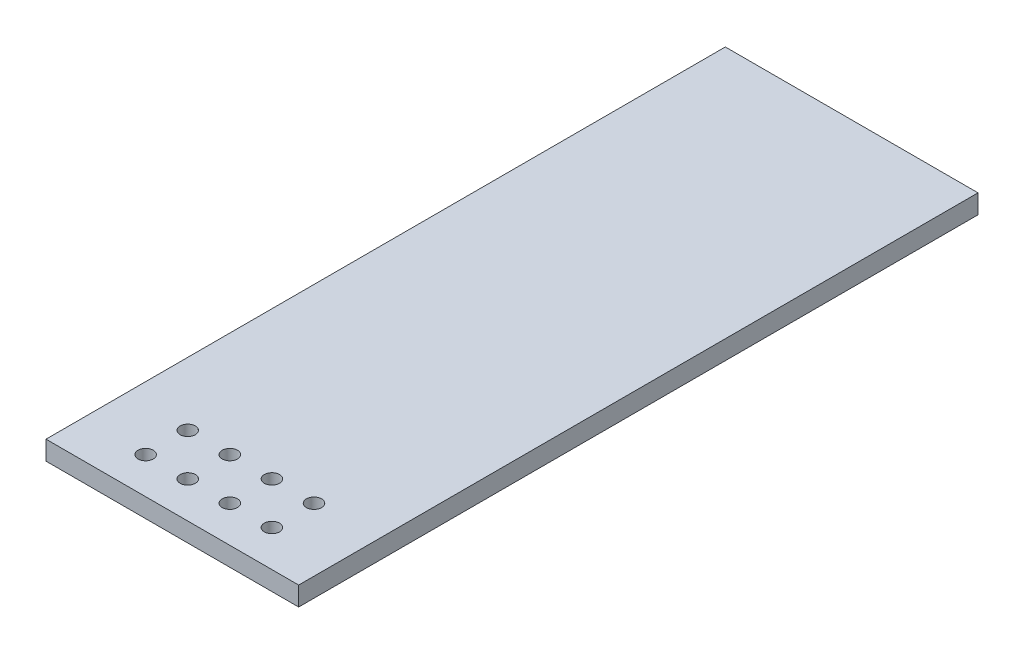
ISO-10303-21;
HEADER;
FILE_DESCRIPTION(('STEP AP214'),'2;1');
FILE_NAME('part.step','',(''),(''),'','','');
FILE_SCHEMA(('AUTOMOTIVE_DESIGN { 1 0 10303 214 1 1 1 1 }'));
ENDSEC;
DATA;
#1=APPLICATION_CONTEXT('core data for automotive mechanical design processes');
#2=APPLICATION_PROTOCOL_DEFINITION('international standard','automotive_design',2000,#1);
#3=PRODUCT_CONTEXT('',#1,'mechanical');
#4=PRODUCT('Part','Part','',(#3));
#5=PRODUCT_RELATED_PRODUCT_CATEGORY('part','',(#4));
#6=PRODUCT_DEFINITION_FORMATION('','',#4);
#7=PRODUCT_DEFINITION_CONTEXT('part definition',#1,'design');
#8=PRODUCT_DEFINITION('design','',#6,#7);
#9=PRODUCT_DEFINITION_SHAPE('','',#8);
#10=(LENGTH_UNIT() NAMED_UNIT(*) SI_UNIT(.MILLI.,.METRE.));
#11=(NAMED_UNIT(*) PLANE_ANGLE_UNIT() SI_UNIT($,.RADIAN.));
#12=(NAMED_UNIT(*) SI_UNIT($,.STERADIAN.) SOLID_ANGLE_UNIT());
#13=UNCERTAINTY_MEASURE_WITH_UNIT(LENGTH_MEASURE(1.E-05),#10,'distance_accuracy_value','');
#14=(GEOMETRIC_REPRESENTATION_CONTEXT(3) GLOBAL_UNCERTAINTY_ASSIGNED_CONTEXT((#13)) GLOBAL_UNIT_ASSIGNED_CONTEXT((#10,
#11,#12)) REPRESENTATION_CONTEXT('',''));
#15=CARTESIAN_POINT('',(0.,0.,0.));
#16=DIRECTION('',(0.,0.,1.));
#17=DIRECTION('',(1.,0.,0.));
#18=AXIS2_PLACEMENT_3D('',#15,#16,#17);
#19=CARTESIAN_POINT('',(0.,1.15,0.));
#20=DIRECTION('',(0.,1.,0.));
#21=DIRECTION('',(0.,0.,1.));
#22=AXIS2_PLACEMENT_3D('',#19,#20,#21);
#23=PLANE('',#22);
#24=DIRECTION('',(0.,0.,1.));
#25=VECTOR('',#24,1.);
#26=CARTESIAN_POINT('',(7.625,1.15,20.5));
#27=LINE('',#26,#25);
#28=CARTESIAN_POINT('',(7.625,1.15,20.5));
#29=VERTEX_POINT('',#28);
#30=CARTESIAN_POINT('',(7.625,1.15,-20.5));
#31=VERTEX_POINT('',#30);
#32=EDGE_CURVE('E55',#29,#31,#27,.F.);
#33=ORIENTED_EDGE('',*,*,#32,.T.);
#34=DIRECTION('',(1.,0.,0.));
#35=VECTOR('',#34,1.);
#36=CARTESIAN_POINT('',(7.625,1.15,-20.5));
#37=LINE('',#36,#35);
#38=CARTESIAN_POINT('',(-7.625,1.15,-20.5));
#39=VERTEX_POINT('',#38);
#40=EDGE_CURVE('E344',#31,#39,#37,.F.);
#41=ORIENTED_EDGE('',*,*,#40,.T.);
#42=DIRECTION('',(0.,0.,-1.));
#43=VECTOR('',#42,1.);
#44=CARTESIAN_POINT('',(-7.625,1.15,20.5));
#45=LINE('',#44,#43);
#46=CARTESIAN_POINT('',(-7.625,1.15,20.5));
#47=VERTEX_POINT('',#46);
#48=EDGE_CURVE('E60',#39,#47,#45,.F.);
#49=ORIENTED_EDGE('',*,*,#48,.T.);
#50=DIRECTION('',(-1.,0.,0.));
#51=VECTOR('',#50,1.);
#52=CARTESIAN_POINT('',(7.625,1.15,20.5));
#53=LINE('',#52,#51);
#54=EDGE_CURVE('E58',#47,#29,#53,.F.);
#55=ORIENTED_EDGE('',*,*,#54,.T.);
#56=EDGE_LOOP('',(#33,#41,#49,#55));
#57=FACE_BOUND('',#56,.T.);
#58=CARTESIAN_POINT('',(-3.81,1.15,18.3));
#59=DIRECTION('',(0.,1.,0.));
#60=DIRECTION('',(0.,0.,1.));
#61=AXIS2_PLACEMENT_3D('',#58,#59,#60);
#62=CIRCLE('',#61,0.459999999999999);
#63=CARTESIAN_POINT('',(-3.81,1.15,18.76));
#64=VERTEX_POINT('',#63);
#65=EDGE_CURVE('E66',#64,#64,#62,.F.);
#66=ORIENTED_EDGE('',*,*,#65,.T.);
#67=EDGE_LOOP('',(#66));
#68=FACE_BOUND('',#67,.T.);
#69=CARTESIAN_POINT('',(3.81,1.15,18.3));
#70=DIRECTION('',(0.,1.,0.));
#71=DIRECTION('',(0.,0.,1.));
#72=AXIS2_PLACEMENT_3D('',#69,#70,#71);
#73=CIRCLE('',#72,0.459999999999999);
#74=CARTESIAN_POINT('',(3.81,1.15,18.76));
#75=VERTEX_POINT('',#74);
#76=EDGE_CURVE('E108',#75,#75,#73,.F.);
#77=ORIENTED_EDGE('',*,*,#76,.T.);
#78=EDGE_LOOP('',(#77));
#79=FACE_BOUND('',#78,.T.);
#80=CARTESIAN_POINT('',(1.27,1.15,18.3));
#81=DIRECTION('',(0.,1.,0.));
#82=DIRECTION('',(0.,0.,1.));
#83=AXIS2_PLACEMENT_3D('',#80,#81,#82);
#84=CIRCLE('',#83,0.459999999999999);
#85=CARTESIAN_POINT('',(1.27,1.15,18.76));
#86=VERTEX_POINT('',#85);
#87=EDGE_CURVE('E111',#86,#86,#84,.F.);
#88=ORIENTED_EDGE('',*,*,#87,.T.);
#89=EDGE_LOOP('',(#88));
#90=FACE_BOUND('',#89,.T.);
#91=CARTESIAN_POINT('',(-1.27,1.15,18.3));
#92=DIRECTION('',(0.,1.,0.));
#93=DIRECTION('',(0.,0.,1.));
#94=AXIS2_PLACEMENT_3D('',#91,#92,#93);
#95=CIRCLE('',#94,0.459999999999999);
#96=CARTESIAN_POINT('',(-1.27,1.15,18.76));
#97=VERTEX_POINT('',#96);
#98=EDGE_CURVE('E114',#97,#97,#95,.F.);
#99=ORIENTED_EDGE('',*,*,#98,.T.);
#100=EDGE_LOOP('',(#99));
#101=FACE_BOUND('',#100,.T.);
#102=CARTESIAN_POINT('',(3.81,1.15,15.76));
#103=DIRECTION('',(0.,1.,0.));
#104=DIRECTION('',(0.,0.,1.));
#105=AXIS2_PLACEMENT_3D('',#102,#103,#104);
#106=CIRCLE('',#105,0.459999999999999);
#107=CARTESIAN_POINT('',(3.81,1.15,16.22));
#108=VERTEX_POINT('',#107);
#109=EDGE_CURVE('E117',#108,#108,#106,.F.);
#110=ORIENTED_EDGE('',*,*,#109,.T.);
#111=EDGE_LOOP('',(#110));
#112=FACE_BOUND('',#111,.T.);
#113=CARTESIAN_POINT('',(1.27,1.15,15.76));
#114=DIRECTION('',(0.,1.,0.));
#115=DIRECTION('',(0.,0.,1.));
#116=AXIS2_PLACEMENT_3D('',#113,#114,#115);
#117=CIRCLE('',#116,0.459999999999999);
#118=CARTESIAN_POINT('',(1.27,1.15,16.22));
#119=VERTEX_POINT('',#118);
#120=EDGE_CURVE('E120',#119,#119,#117,.F.);
#121=ORIENTED_EDGE('',*,*,#120,.T.);
#122=EDGE_LOOP('',(#121));
#123=FACE_BOUND('',#122,.T.);
#124=CARTESIAN_POINT('',(-1.27,1.15,15.76));
#125=DIRECTION('',(0.,1.,0.));
#126=DIRECTION('',(0.,0.,1.));
#127=AXIS2_PLACEMENT_3D('',#124,#125,#126);
#128=CIRCLE('',#127,0.459999999999999);
#129=CARTESIAN_POINT('',(-1.27,1.15,16.22));
#130=VERTEX_POINT('',#129);
#131=EDGE_CURVE('E122',#130,#130,#128,.F.);
#132=ORIENTED_EDGE('',*,*,#131,.T.);
#133=EDGE_LOOP('',(#132));
#134=FACE_BOUND('',#133,.T.);
#135=CARTESIAN_POINT('',(-3.81,1.15,15.76));
#136=DIRECTION('',(0.,1.,0.));
#137=DIRECTION('',(0.,0.,1.));
#138=AXIS2_PLACEMENT_3D('',#135,#136,#137);
#139=CIRCLE('',#138,0.459999999999999);
#140=CARTESIAN_POINT('',(-3.81,1.15,16.22));
#141=VERTEX_POINT('',#140);
#142=EDGE_CURVE('E20',#141,#141,#139,.F.);
#143=ORIENTED_EDGE('',*,*,#142,.T.);
#144=EDGE_LOOP('',(#143));
#145=FACE_BOUND('',#144,.T.);
#146=ADVANCED_FACE('F17',(#57,#68,#79,#90,#101,#112,#123,#134,#145),#23,.T.);
#147=CARTESIAN_POINT('',(-3.81,-1.30107647738325,15.76));
#148=DIRECTION('',(0.,1.,0.));
#149=DIRECTION('',(0.,0.,1.));
#150=AXIS2_PLACEMENT_3D('',#147,#148,#149);
#151=CYLINDRICAL_SURFACE('',#150,0.459999999999999);
#152=ORIENTED_EDGE('',*,*,#142,.F.);
#153=EDGE_LOOP('',(#152));
#154=FACE_BOUND('',#153,.T.);
#155=CARTESIAN_POINT('',(-3.81,0.,15.76));
#156=DIRECTION('',(0.,1.,0.));
#157=DIRECTION('',(0.,0.,1.));
#158=AXIS2_PLACEMENT_3D('',#155,#156,#157);
#159=CIRCLE('',#158,0.459999999999999);
#160=CARTESIAN_POINT('',(-3.81,0.,16.22));
#161=VERTEX_POINT('',#160);
#162=EDGE_CURVE('E102',#161,#161,#159,.F.);
#163=ORIENTED_EDGE('',*,*,#162,.T.);
#164=EDGE_LOOP('',(#163));
#165=FACE_BOUND('',#164,.T.);
#166=ADVANCED_FACE('F130',(#154,#165),#151,.F.);
#167=CARTESIAN_POINT('',(-1.27,-1.30107647738325,15.76));
#168=DIRECTION('',(0.,1.,0.));
#169=DIRECTION('',(0.,0.,1.));
#170=AXIS2_PLACEMENT_3D('',#167,#168,#169);
#171=CYLINDRICAL_SURFACE('',#170,0.459999999999999);
#172=ORIENTED_EDGE('',*,*,#131,.F.);
#173=EDGE_LOOP('',(#172));
#174=FACE_BOUND('',#173,.T.);
#175=CARTESIAN_POINT('',(-1.27,0.,15.76));
#176=DIRECTION('',(0.,1.,0.));
#177=DIRECTION('',(0.,0.,1.));
#178=AXIS2_PLACEMENT_3D('',#175,#176,#177);
#179=CIRCLE('',#178,0.459999999999999);
#180=CARTESIAN_POINT('',(-1.27,0.,16.22));
#181=VERTEX_POINT('',#180);
#182=EDGE_CURVE('E99',#181,#181,#179,.F.);
#183=ORIENTED_EDGE('',*,*,#182,.T.);
#184=EDGE_LOOP('',(#183));
#185=FACE_BOUND('',#184,.T.);
#186=ADVANCED_FACE('F133',(#174,#185),#171,.F.);
#187=CARTESIAN_POINT('',(1.27,-1.30107647738325,15.76));
#188=DIRECTION('',(0.,1.,0.));
#189=DIRECTION('',(0.,0.,1.));
#190=AXIS2_PLACEMENT_3D('',#187,#188,#189);
#191=CYLINDRICAL_SURFACE('',#190,0.459999999999999);
#192=ORIENTED_EDGE('',*,*,#120,.F.);
#193=EDGE_LOOP('',(#192));
#194=FACE_BOUND('',#193,.T.);
#195=CARTESIAN_POINT('',(1.27,0.,15.76));
#196=DIRECTION('',(0.,1.,0.));
#197=DIRECTION('',(0.,0.,1.));
#198=AXIS2_PLACEMENT_3D('',#195,#196,#197);
#199=CIRCLE('',#198,0.459999999999999);
#200=CARTESIAN_POINT('',(1.27,0.,16.22));
#201=VERTEX_POINT('',#200);
#202=EDGE_CURVE('E96',#201,#201,#199,.F.);
#203=ORIENTED_EDGE('',*,*,#202,.T.);
#204=EDGE_LOOP('',(#203));
#205=FACE_BOUND('',#204,.T.);
#206=ADVANCED_FACE('F176',(#194,#205),#191,.F.);
#207=CARTESIAN_POINT('',(3.81,-1.30107647738325,15.76));
#208=DIRECTION('',(0.,1.,0.));
#209=DIRECTION('',(0.,0.,1.));
#210=AXIS2_PLACEMENT_3D('',#207,#208,#209);
#211=CYLINDRICAL_SURFACE('',#210,0.459999999999999);
#212=ORIENTED_EDGE('',*,*,#109,.F.);
#213=EDGE_LOOP('',(#212));
#214=FACE_BOUND('',#213,.T.);
#215=CARTESIAN_POINT('',(3.81,0.,15.76));
#216=DIRECTION('',(0.,1.,0.));
#217=DIRECTION('',(0.,0.,1.));
#218=AXIS2_PLACEMENT_3D('',#215,#216,#217);
#219=CIRCLE('',#218,0.459999999999999);
#220=CARTESIAN_POINT('',(3.81,0.,16.22));
#221=VERTEX_POINT('',#220);
#222=EDGE_CURVE('E93',#221,#221,#219,.F.);
#223=ORIENTED_EDGE('',*,*,#222,.T.);
#224=EDGE_LOOP('',(#223));
#225=FACE_BOUND('',#224,.T.);
#226=ADVANCED_FACE('F172',(#214,#225),#211,.F.);
#227=CARTESIAN_POINT('',(-1.27,-1.30107647738325,18.3));
#228=DIRECTION('',(0.,1.,0.));
#229=DIRECTION('',(0.,0.,1.));
#230=AXIS2_PLACEMENT_3D('',#227,#228,#229);
#231=CYLINDRICAL_SURFACE('',#230,0.459999999999999);
#232=ORIENTED_EDGE('',*,*,#98,.F.);
#233=EDGE_LOOP('',(#232));
#234=FACE_BOUND('',#233,.T.);
#235=CARTESIAN_POINT('',(-1.27,0.,18.3));
#236=DIRECTION('',(0.,1.,0.));
#237=DIRECTION('',(0.,0.,1.));
#238=AXIS2_PLACEMENT_3D('',#235,#236,#237);
#239=CIRCLE('',#238,0.459999999999999);
#240=CARTESIAN_POINT('',(-1.27,0.,18.76));
#241=VERTEX_POINT('',#240);
#242=EDGE_CURVE('E90',#241,#241,#239,.F.);
#243=ORIENTED_EDGE('',*,*,#242,.T.);
#244=EDGE_LOOP('',(#243));
#245=FACE_BOUND('',#244,.T.);
#246=ADVANCED_FACE('F168',(#234,#245),#231,.F.);
#247=CARTESIAN_POINT('',(1.27,-1.30107647738325,18.3));
#248=DIRECTION('',(0.,1.,0.));
#249=DIRECTION('',(0.,0.,1.));
#250=AXIS2_PLACEMENT_3D('',#247,#248,#249);
#251=CYLINDRICAL_SURFACE('',#250,0.459999999999999);
#252=ORIENTED_EDGE('',*,*,#87,.F.);
#253=EDGE_LOOP('',(#252));
#254=FACE_BOUND('',#253,.T.);
#255=CARTESIAN_POINT('',(1.27,0.,18.3));
#256=DIRECTION('',(0.,1.,0.));
#257=DIRECTION('',(0.,0.,1.));
#258=AXIS2_PLACEMENT_3D('',#255,#256,#257);
#259=CIRCLE('',#258,0.459999999999999);
#260=CARTESIAN_POINT('',(1.27,0.,18.76));
#261=VERTEX_POINT('',#260);
#262=EDGE_CURVE('E87',#261,#261,#259,.F.);
#263=ORIENTED_EDGE('',*,*,#262,.T.);
#264=EDGE_LOOP('',(#263));
#265=FACE_BOUND('',#264,.T.);
#266=ADVANCED_FACE('F164',(#254,#265),#251,.F.);
#267=CARTESIAN_POINT('',(3.81,-1.30107647738325,18.3));
#268=DIRECTION('',(0.,1.,0.));
#269=DIRECTION('',(0.,0.,1.));
#270=AXIS2_PLACEMENT_3D('',#267,#268,#269);
#271=CYLINDRICAL_SURFACE('',#270,0.459999999999999);
#272=ORIENTED_EDGE('',*,*,#76,.F.);
#273=EDGE_LOOP('',(#272));
#274=FACE_BOUND('',#273,.T.);
#275=CARTESIAN_POINT('',(3.81,0.,18.3));
#276=DIRECTION('',(0.,1.,0.));
#277=DIRECTION('',(0.,0.,1.));
#278=AXIS2_PLACEMENT_3D('',#275,#276,#277);
#279=CIRCLE('',#278,0.459999999999999);
#280=CARTESIAN_POINT('',(3.81,0.,18.76));
#281=VERTEX_POINT('',#280);
#282=EDGE_CURVE('E84',#281,#281,#279,.F.);
#283=ORIENTED_EDGE('',*,*,#282,.T.);
#284=EDGE_LOOP('',(#283));
#285=FACE_BOUND('',#284,.T.);
#286=ADVANCED_FACE('F160',(#274,#285),#271,.F.);
#287=CARTESIAN_POINT('',(-3.81,-1.30107647738325,18.3));
#288=DIRECTION('',(0.,1.,0.));
#289=DIRECTION('',(0.,0.,1.));
#290=AXIS2_PLACEMENT_3D('',#287,#288,#289);
#291=CYLINDRICAL_SURFACE('',#290,0.459999999999999);
#292=ORIENTED_EDGE('',*,*,#65,.F.);
#293=EDGE_LOOP('',(#292));
#294=FACE_BOUND('',#293,.T.);
#295=CARTESIAN_POINT('',(-3.81,0.,18.3));
#296=DIRECTION('',(0.,1.,0.));
#297=DIRECTION('',(0.,0.,1.));
#298=AXIS2_PLACEMENT_3D('',#295,#296,#297);
#299=CIRCLE('',#298,0.459999999999999);
#300=CARTESIAN_POINT('',(-3.81,0.,18.76));
#301=VERTEX_POINT('',#300);
#302=EDGE_CURVE('E81',#301,#301,#299,.F.);
#303=ORIENTED_EDGE('',*,*,#302,.T.);
#304=EDGE_LOOP('',(#303));
#305=FACE_BOUND('',#304,.T.);
#306=ADVANCED_FACE('F157',(#294,#305),#291,.F.);
#307=CARTESIAN_POINT('',(7.625,1.15,20.5));
#308=DIRECTION('',(0.,0.,-1.));
#309=DIRECTION('',(-1.,0.,0.));
#310=AXIS2_PLACEMENT_3D('',#307,#308,#309);
#311=PLANE('',#310);
#312=DIRECTION('',(0.,1.,0.));
#313=VECTOR('',#312,1.);
#314=CARTESIAN_POINT('',(7.625,1.15,20.5));
#315=LINE('',#314,#313);
#316=CARTESIAN_POINT('',(7.625,0.,20.5));
#317=VERTEX_POINT('',#316);
#318=EDGE_CURVE('E65',#317,#29,#315,.T.);
#319=ORIENTED_EDGE('',*,*,#318,.T.);
#320=ORIENTED_EDGE('',*,*,#54,.F.);
#321=DIRECTION('',(0.,1.,0.));
#322=VECTOR('',#321,1.);
#323=CARTESIAN_POINT('',(-7.625,1.15,20.5));
#324=LINE('',#323,#322);
#325=CARTESIAN_POINT('',(-7.625,0.,20.5));
#326=VERTEX_POINT('',#325);
#327=EDGE_CURVE('E105',#47,#326,#324,.F.);
#328=ORIENTED_EDGE('',*,*,#327,.T.);
#329=DIRECTION('',(1.,0.,0.));
#330=VECTOR('',#329,1.);
#331=CARTESIAN_POINT('',(0.,0.,20.5));
#332=LINE('',#331,#330);
#333=EDGE_CURVE('E77',#326,#317,#332,.T.);
#334=ORIENTED_EDGE('',*,*,#333,.T.);
#335=EDGE_LOOP('',(#319,#320,#328,#334));
#336=FACE_BOUND('',#335,.T.);
#337=ADVANCED_FACE('F76',(#336),#311,.F.);
#338=CARTESIAN_POINT('',(7.625,1.15,20.5));
#339=DIRECTION('',(-1.,0.,0.));
#340=DIRECTION('',(0.,0.,1.));
#341=AXIS2_PLACEMENT_3D('',#338,#339,#340);
#342=PLANE('',#341);
#343=DIRECTION('',(0.,1.,0.));
#344=VECTOR('',#343,1.);
#345=CARTESIAN_POINT('',(7.625,1.15,-20.5));
#346=LINE('',#345,#344);
#347=CARTESIAN_POINT('',(7.625,0.,-20.5));
#348=VERTEX_POINT('',#347);
#349=EDGE_CURVE('E73',#348,#31,#346,.T.);
#350=ORIENTED_EDGE('',*,*,#349,.T.);
#351=ORIENTED_EDGE('',*,*,#32,.F.);
#352=ORIENTED_EDGE('',*,*,#318,.F.);
#353=DIRECTION('',(0.,0.,1.));
#354=VECTOR('',#353,1.);
#355=CARTESIAN_POINT('',(7.625,0.,0.));
#356=LINE('',#355,#354);
#357=EDGE_CURVE('E351',#317,#348,#356,.F.);
#358=ORIENTED_EDGE('',*,*,#357,.T.);
#359=EDGE_LOOP('',(#350,#351,#352,#358));
#360=FACE_BOUND('',#359,.T.);
#361=ADVANCED_FACE('F70',(#360),#342,.F.);
#362=CARTESIAN_POINT('',(7.625,1.15,-20.5));
#363=DIRECTION('',(0.,0.,1.));
#364=DIRECTION('',(1.,0.,0.));
#365=AXIS2_PLACEMENT_3D('',#362,#363,#364);
#366=PLANE('',#365);
#367=DIRECTION('',(0.,1.,0.));
#368=VECTOR('',#367,1.);
#369=CARTESIAN_POINT('',(-7.625,1.15,-20.5));
#370=LINE('',#369,#368);
#371=CARTESIAN_POINT('',(-7.625,0.,-20.5));
#372=VERTEX_POINT('',#371);
#373=EDGE_CURVE('E34',#372,#39,#370,.T.);
#374=ORIENTED_EDGE('',*,*,#373,.T.);
#375=ORIENTED_EDGE('',*,*,#40,.F.);
#376=ORIENTED_EDGE('',*,*,#349,.F.);
#377=DIRECTION('',(1.,0.,0.));
#378=VECTOR('',#377,1.);
#379=CARTESIAN_POINT('',(0.,0.,-20.5));
#380=LINE('',#379,#378);
#381=EDGE_CURVE('E26',#348,#372,#380,.F.);
#382=ORIENTED_EDGE('',*,*,#381,.T.);
#383=EDGE_LOOP('',(#374,#375,#376,#382));
#384=FACE_BOUND('',#383,.T.);
#385=ADVANCED_FACE('F145',(#384),#366,.F.);
#386=CARTESIAN_POINT('',(-7.625,1.15,20.5));
#387=DIRECTION('',(1.,0.,0.));
#388=DIRECTION('',(0.,0.,-1.));
#389=AXIS2_PLACEMENT_3D('',#386,#387,#388);
#390=PLANE('',#389);
#391=ORIENTED_EDGE('',*,*,#327,.F.);
#392=ORIENTED_EDGE('',*,*,#48,.F.);
#393=ORIENTED_EDGE('',*,*,#373,.F.);
#394=DIRECTION('',(0.,0.,1.));
#395=VECTOR('',#394,1.);
#396=CARTESIAN_POINT('',(-7.625,0.,0.));
#397=LINE('',#396,#395);
#398=EDGE_CURVE('E11',#372,#326,#397,.T.);
#399=ORIENTED_EDGE('',*,*,#398,.T.);
#400=EDGE_LOOP('',(#391,#392,#393,#399));
#401=FACE_BOUND('',#400,.T.);
#402=ADVANCED_FACE('F138',(#401),#390,.F.);
#403=CARTESIAN_POINT('',(0.,0.,0.));
#404=DIRECTION('',(0.,1.,0.));
#405=DIRECTION('',(0.,0.,1.));
#406=AXIS2_PLACEMENT_3D('',#403,#404,#405);
#407=PLANE('',#406);
#408=ORIENTED_EDGE('',*,*,#381,.F.);
#409=ORIENTED_EDGE('',*,*,#357,.F.);
#410=ORIENTED_EDGE('',*,*,#333,.F.);
#411=ORIENTED_EDGE('',*,*,#398,.F.);
#412=EDGE_LOOP('',(#408,#409,#410,#411));
#413=FACE_BOUND('',#412,.T.);
#414=ORIENTED_EDGE('',*,*,#302,.F.);
#415=EDGE_LOOP('',(#414));
#416=FACE_BOUND('',#415,.T.);
#417=ORIENTED_EDGE('',*,*,#282,.F.);
#418=EDGE_LOOP('',(#417));
#419=FACE_BOUND('',#418,.T.);
#420=ORIENTED_EDGE('',*,*,#262,.F.);
#421=EDGE_LOOP('',(#420));
#422=FACE_BOUND('',#421,.T.);
#423=ORIENTED_EDGE('',*,*,#242,.F.);
#424=EDGE_LOOP('',(#423));
#425=FACE_BOUND('',#424,.T.);
#426=ORIENTED_EDGE('',*,*,#222,.F.);
#427=EDGE_LOOP('',(#426));
#428=FACE_BOUND('',#427,.T.);
#429=ORIENTED_EDGE('',*,*,#202,.F.);
#430=EDGE_LOOP('',(#429));
#431=FACE_BOUND('',#430,.T.);
#432=ORIENTED_EDGE('',*,*,#182,.F.);
#433=EDGE_LOOP('',(#432));
#434=FACE_BOUND('',#433,.T.);
#435=ORIENTED_EDGE('',*,*,#162,.F.);
#436=EDGE_LOOP('',(#435));
#437=FACE_BOUND('',#436,.T.);
#438=ADVANCED_FACE('F136',(#413,#416,#419,#422,#425,#428,#431,#434,#437),#407,.F.);
#439=CLOSED_SHELL('',(#146,#166,#186,#206,#226,#246,#266,#286,#306,#337,#361,#385,#402,#438));
#440=MANIFOLD_SOLID_BREP('B1',#439);
#441=ADVANCED_BREP_SHAPE_REPRESENTATION('',(#18,#440),#14);
#442=SHAPE_DEFINITION_REPRESENTATION(#9,#441);
ENDSEC;
END-ISO-10303-21;
